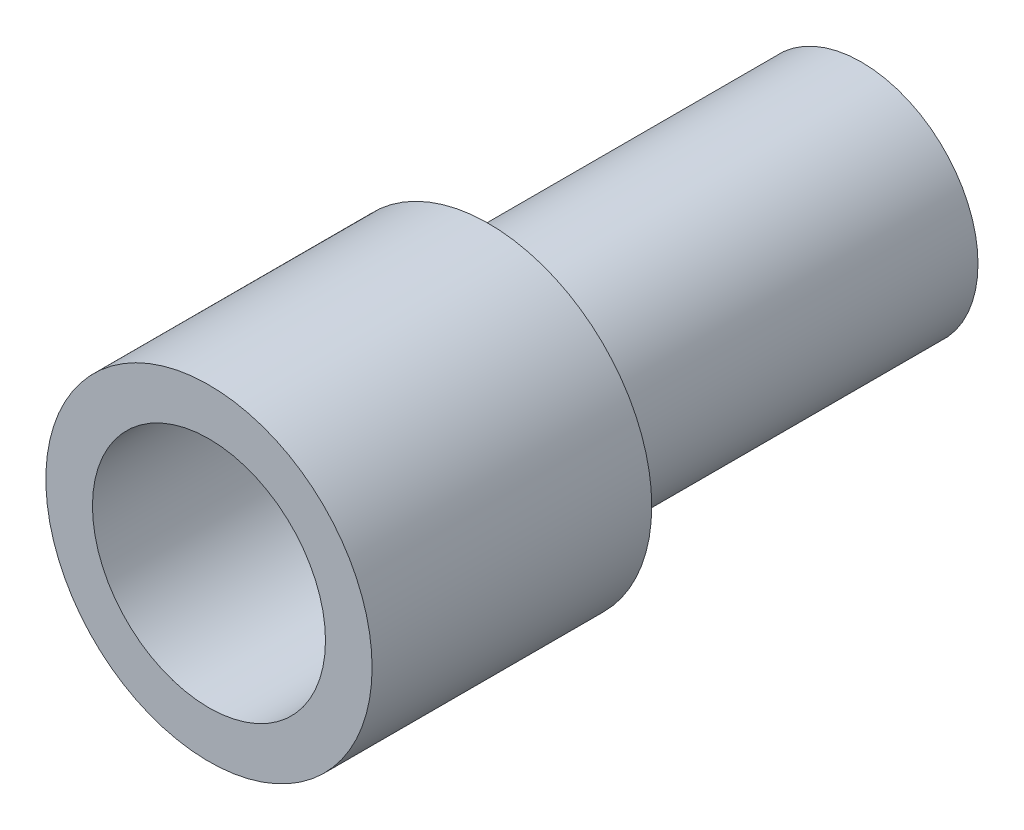
ISO-10303-21;
HEADER;
FILE_DESCRIPTION(('STEP AP214'),'2;1');
FILE_NAME('part.step','',(''),(''),'','','');
FILE_SCHEMA(('AUTOMOTIVE_DESIGN { 1 0 10303 214 1 1 1 1 }'));
ENDSEC;
DATA;
#1=APPLICATION_CONTEXT('core data for automotive mechanical design processes');
#2=APPLICATION_PROTOCOL_DEFINITION('international standard','automotive_design',2000,#1);
#3=PRODUCT_CONTEXT('',#1,'mechanical');
#4=PRODUCT('Part','Part','',(#3));
#5=PRODUCT_RELATED_PRODUCT_CATEGORY('part','',(#4));
#6=PRODUCT_DEFINITION_FORMATION('','',#4);
#7=PRODUCT_DEFINITION_CONTEXT('part definition',#1,'design');
#8=PRODUCT_DEFINITION('design','',#6,#7);
#9=PRODUCT_DEFINITION_SHAPE('','',#8);
#10=(LENGTH_UNIT() NAMED_UNIT(*) SI_UNIT(.MILLI.,.METRE.));
#11=(NAMED_UNIT(*) PLANE_ANGLE_UNIT() SI_UNIT($,.RADIAN.));
#12=(NAMED_UNIT(*) SI_UNIT($,.STERADIAN.) SOLID_ANGLE_UNIT());
#13=UNCERTAINTY_MEASURE_WITH_UNIT(LENGTH_MEASURE(1.E-05),#10,'distance_accuracy_value','');
#14=(GEOMETRIC_REPRESENTATION_CONTEXT(3) GLOBAL_UNCERTAINTY_ASSIGNED_CONTEXT((#13)) GLOBAL_UNIT_ASSIGNED_CONTEXT((#10,
#11,#12)) REPRESENTATION_CONTEXT('',''));
#15=CARTESIAN_POINT('',(0.,0.,0.));
#16=DIRECTION('',(0.,0.,1.));
#17=DIRECTION('',(1.,0.,0.));
#18=AXIS2_PLACEMENT_3D('',#15,#16,#17);
#19=CARTESIAN_POINT('',(0.,0.,6.));
#20=DIRECTION('',(0.,0.,-1.));
#21=DIRECTION('',(-1.,0.,0.));
#22=AXIS2_PLACEMENT_3D('',#19,#20,#21);
#23=CYLINDRICAL_SURFACE('',#22,3.5);
#24=CARTESIAN_POINT('',(0.,0.,6.));
#25=DIRECTION('',(0.,0.,1.));
#26=DIRECTION('',(1.,0.,0.));
#27=AXIS2_PLACEMENT_3D('',#24,#25,#26);
#28=CIRCLE('',#27,3.5);
#29=CARTESIAN_POINT('',(3.5,0.,6.));
#30=VERTEX_POINT('',#29);
#31=EDGE_CURVE('E40',#30,#30,#28,.T.);
#32=ORIENTED_EDGE('',*,*,#31,.F.);
#33=EDGE_LOOP('',(#32));
#34=FACE_BOUND('',#33,.T.);
#35=CARTESIAN_POINT('',(0.,0.,0.));
#36=DIRECTION('',(0.,0.,1.));
#37=DIRECTION('',(1.,0.,0.));
#38=AXIS2_PLACEMENT_3D('',#35,#36,#37);
#39=CIRCLE('',#38,3.5);
#40=CARTESIAN_POINT('',(3.5,0.,0.));
#41=VERTEX_POINT('',#40);
#42=EDGE_CURVE('E36',#41,#41,#39,.T.);
#43=ORIENTED_EDGE('',*,*,#42,.T.);
#44=EDGE_LOOP('',(#43));
#45=FACE_BOUND('',#44,.T.);
#46=ADVANCED_FACE('F33',(#34,#45),#23,.T.);
#47=CARTESIAN_POINT('',(0.,0.,6.));
#48=DIRECTION('',(0.,0.,1.));
#49=DIRECTION('',(1.,0.,0.));
#50=AXIS2_PLACEMENT_3D('',#47,#48,#49);
#51=PLANE('',#50);
#52=CARTESIAN_POINT('',(0.,0.,6.));
#53=DIRECTION('',(0.,0.,1.));
#54=DIRECTION('',(1.,0.,0.));
#55=AXIS2_PLACEMENT_3D('',#52,#53,#54);
#56=CIRCLE('',#55,2.5);
#57=CARTESIAN_POINT('',(2.5,0.,6.));
#58=VERTEX_POINT('',#57);
#59=EDGE_CURVE('E51',#58,#58,#56,.T.);
#60=ORIENTED_EDGE('',*,*,#59,.F.);
#61=EDGE_LOOP('',(#60));
#62=FACE_BOUND('',#61,.T.);
#63=ORIENTED_EDGE('',*,*,#31,.T.);
#64=EDGE_LOOP('',(#63));
#65=FACE_BOUND('',#64,.T.);
#66=ADVANCED_FACE('F73',(#62,#65),#51,.T.);
#67=CARTESIAN_POINT('',(0.,0.,0.));
#68=DIRECTION('',(0.,0.,1.));
#69=DIRECTION('',(1.,0.,0.));
#70=AXIS2_PLACEMENT_3D('',#67,#68,#69);
#71=PLANE('',#70);
#72=CARTESIAN_POINT('',(0.,0.,0.));
#73=DIRECTION('',(0.,0.,-1.));
#74=DIRECTION('',(-1.,0.,0.));
#75=AXIS2_PLACEMENT_3D('',#72,#73,#74);
#76=CIRCLE('',#75,2.5);
#77=CARTESIAN_POINT('',(-2.5,0.,0.));
#78=VERTEX_POINT('',#77);
#79=EDGE_CURVE('E10',#78,#78,#76,.T.);
#80=ORIENTED_EDGE('',*,*,#79,.F.);
#81=EDGE_LOOP('',(#80));
#82=FACE_BOUND('',#81,.T.);
#83=ORIENTED_EDGE('',*,*,#42,.F.);
#84=EDGE_LOOP('',(#83));
#85=FACE_BOUND('',#84,.T.);
#86=ADVANCED_FACE('F78',(#82,#85),#71,.F.);
#87=CARTESIAN_POINT('',(0.,0.,1.));
#88=DIRECTION('',(0.,0.,1.));
#89=DIRECTION('',(1.,0.,0.));
#90=AXIS2_PLACEMENT_3D('',#87,#88,#89);
#91=CYLINDRICAL_SURFACE('',#90,2.5);
#92=CARTESIAN_POINT('',(0.,0.,1.));
#93=DIRECTION('',(0.,0.,1.));
#94=DIRECTION('',(1.,0.,0.));
#95=AXIS2_PLACEMENT_3D('',#92,#93,#94);
#96=CIRCLE('',#95,2.5);
#97=CARTESIAN_POINT('',(2.5,0.,1.));
#98=VERTEX_POINT('',#97);
#99=EDGE_CURVE('E48',#98,#98,#96,.T.);
#100=ORIENTED_EDGE('',*,*,#99,.F.);
#101=EDGE_LOOP('',(#100));
#102=FACE_BOUND('',#101,.T.);
#103=ORIENTED_EDGE('',*,*,#59,.T.);
#104=EDGE_LOOP('',(#103));
#105=FACE_BOUND('',#104,.T.);
#106=ADVANCED_FACE('F69',(#102,#105),#91,.F.);
#107=CARTESIAN_POINT('',(0.,0.,1.));
#108=DIRECTION('',(0.,0.,1.));
#109=DIRECTION('',(1.,0.,0.));
#110=AXIS2_PLACEMENT_3D('',#107,#108,#109);
#111=PLANE('',#110);
#112=ORIENTED_EDGE('',*,*,#99,.T.);
#113=EDGE_LOOP('',(#112));
#114=FACE_BOUND('',#113,.T.);
#115=ADVANCED_FACE('F62',(#114),#111,.T.);
#116=CARTESIAN_POINT('',(0.,0.,-8.));
#117=DIRECTION('',(0.,0.,1.));
#118=DIRECTION('',(1.,0.,0.));
#119=AXIS2_PLACEMENT_3D('',#116,#117,#118);
#120=CYLINDRICAL_SURFACE('',#119,2.5);
#121=CARTESIAN_POINT('',(0.,0.,-8.));
#122=DIRECTION('',(0.,0.,-1.));
#123=DIRECTION('',(-1.,0.,0.));
#124=AXIS2_PLACEMENT_3D('',#121,#122,#123);
#125=CIRCLE('',#124,2.5);
#126=CARTESIAN_POINT('',(-2.5,0.,-8.));
#127=VERTEX_POINT('',#126);
#128=EDGE_CURVE('E47',#127,#127,#125,.T.);
#129=ORIENTED_EDGE('',*,*,#128,.F.);
#130=EDGE_LOOP('',(#129));
#131=FACE_BOUND('',#130,.T.);
#132=ORIENTED_EDGE('',*,*,#79,.T.);
#133=EDGE_LOOP('',(#132));
#134=FACE_BOUND('',#133,.T.);
#135=ADVANCED_FACE('F60',(#131,#134),#120,.T.);
#136=CARTESIAN_POINT('',(0.,0.,-8.));
#137=DIRECTION('',(0.,0.,-1.));
#138=DIRECTION('',(-1.,0.,0.));
#139=AXIS2_PLACEMENT_3D('',#136,#137,#138);
#140=PLANE('',#139);
#141=ORIENTED_EDGE('',*,*,#128,.T.);
#142=EDGE_LOOP('',(#141));
#143=FACE_BOUND('',#142,.T.);
#144=ADVANCED_FACE('F58',(#143),#140,.T.);
#145=CLOSED_SHELL('',(#46,#66,#86,#106,#115,#135,#144));
#146=MANIFOLD_SOLID_BREP('B2',#145);
#147=ADVANCED_BREP_SHAPE_REPRESENTATION('',(#18,#146),#14);
#148=SHAPE_DEFINITION_REPRESENTATION(#9,#147);
ENDSEC;
END-ISO-10303-21;
